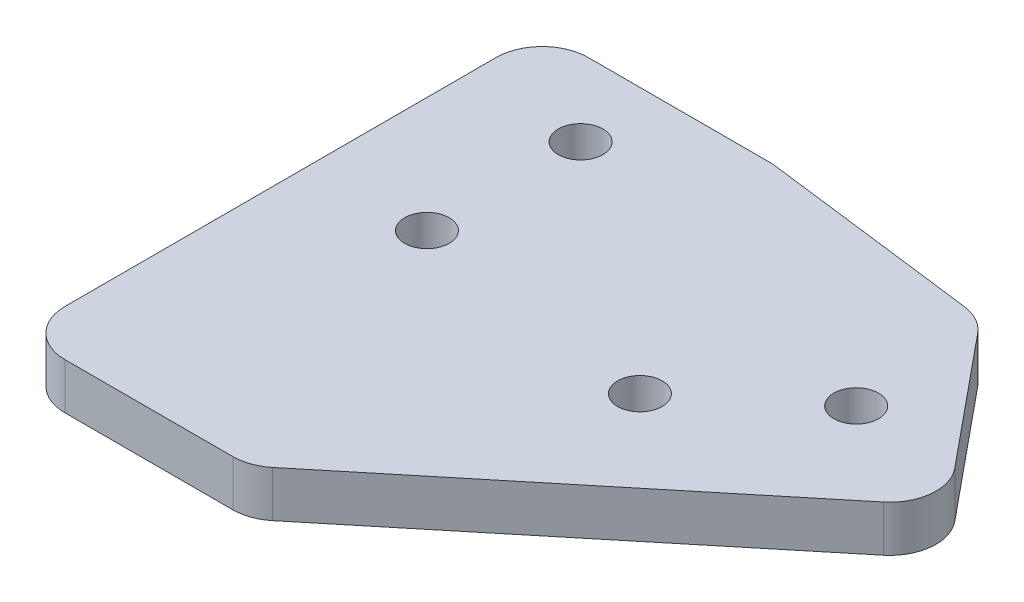
ISO-10303-21;
HEADER;
FILE_DESCRIPTION(('STEP AP214'),'2;1');
FILE_NAME('part.step','',(''),(''),'','','');
FILE_SCHEMA(('AUTOMOTIVE_DESIGN { 1 0 10303 214 1 1 1 1 }'));
ENDSEC;
DATA;
#1=APPLICATION_CONTEXT('core data for automotive mechanical design processes');
#2=APPLICATION_PROTOCOL_DEFINITION('international standard','automotive_design',2000,#1);
#3=PRODUCT_CONTEXT('',#1,'mechanical');
#4=PRODUCT('Part','Part','',(#3));
#5=PRODUCT_RELATED_PRODUCT_CATEGORY('part','',(#4));
#6=PRODUCT_DEFINITION_FORMATION('','',#4);
#7=PRODUCT_DEFINITION_CONTEXT('part definition',#1,'design');
#8=PRODUCT_DEFINITION('design','',#6,#7);
#9=PRODUCT_DEFINITION_SHAPE('','',#8);
#10=(LENGTH_UNIT() NAMED_UNIT(*) SI_UNIT(.MILLI.,.METRE.));
#11=(NAMED_UNIT(*) PLANE_ANGLE_UNIT() SI_UNIT($,.RADIAN.));
#12=(NAMED_UNIT(*) SI_UNIT($,.STERADIAN.) SOLID_ANGLE_UNIT());
#13=UNCERTAINTY_MEASURE_WITH_UNIT(LENGTH_MEASURE(1.E-05),#10,'distance_accuracy_value','');
#14=(GEOMETRIC_REPRESENTATION_CONTEXT(3) GLOBAL_UNCERTAINTY_ASSIGNED_CONTEXT((#13)) GLOBAL_UNIT_ASSIGNED_CONTEXT((#10,
#11,#12)) REPRESENTATION_CONTEXT('',''));
#15=CARTESIAN_POINT('',(0.,0.,0.));
#16=DIRECTION('',(0.,0.,1.));
#17=DIRECTION('',(1.,0.,0.));
#18=AXIS2_PLACEMENT_3D('',#15,#16,#17);
#19=CARTESIAN_POINT('',(0.,3.,0.));
#20=DIRECTION('',(0.,1.,0.));
#21=DIRECTION('',(0.,0.,1.));
#22=AXIS2_PLACEMENT_3D('',#19,#20,#21);
#23=PLANE('',#22);
#24=CARTESIAN_POINT('',(-192.5,3.,-20.));
#25=DIRECTION('',(0.,1.,0.));
#26=DIRECTION('',(0.,0.,1.));
#27=AXIS2_PLACEMENT_3D('',#24,#25,#26);
#28=CIRCLE('',#27,1.45);
#29=CARTESIAN_POINT('',(-192.5,3.,-18.55));
#30=VERTEX_POINT('',#29);
#31=EDGE_CURVE('E340',#30,#30,#28,.T.);
#32=ORIENTED_EDGE('',*,*,#31,.F.);
#33=EDGE_LOOP('',(#32));
#34=FACE_BOUND('',#33,.T.);
#35=CARTESIAN_POINT('',(-176.375827257806,3.,-7.73583593589446));
#36=DIRECTION('',(0.,1.,0.));
#37=DIRECTION('',(0.,0.,1.));
#38=AXIS2_PLACEMENT_3D('',#35,#36,#37);
#39=CIRCLE('',#38,1.45);
#40=CARTESIAN_POINT('',(-176.375827257806,3.,-6.28583593589446));
#41=VERTEX_POINT('',#40);
#42=EDGE_CURVE('E159',#41,#41,#39,.T.);
#43=ORIENTED_EDGE('',*,*,#42,.F.);
#44=EDGE_LOOP('',(#43));
#45=FACE_BOUND('',#44,.T.);
#46=DIRECTION('',(1.,0.,0.));
#47=VECTOR('',#46,1.);
#48=CARTESIAN_POINT('',(-185.,3.,9.05416514357188));
#49=LINE('',#48,#47);
#50=CARTESIAN_POINT('',(-197.,3.,9.05416514357169));
#51=VERTEX_POINT('',#50);
#52=CARTESIAN_POINT('',(-186.074172311059,3.,9.05416514357186));
#53=VERTEX_POINT('',#52);
#54=EDGE_CURVE('E168',#51,#53,#49,.T.);
#55=ORIENTED_EDGE('',*,*,#54,.T.);
#56=CARTESIAN_POINT('',(-186.074172311059,3.,6.05416514357186));
#57=DIRECTION('',(0.,1.,0.));
#58=DIRECTION('',(0.,0.,1.));
#59=AXIS2_PLACEMENT_3D('',#56,#57,#58);
#60=CIRCLE('',#59,3.);
#61=CARTESIAN_POINT('',(-184.169957759636,3.,8.37234696175367));
#62=VERTEX_POINT('',#61);
#63=EDGE_CURVE('E201',#53,#62,#60,.T.);
#64=ORIENTED_EDGE('',*,*,#63,.T.);
#65=DIRECTION('',(0.772727272727269,0.,-0.634738183807683));
#66=VECTOR('',#65,1.);
#67=CARTESIAN_POINT('',(-175.478927242885,3.,1.23330952859855));
#68=LINE('',#67,#66);
#69=CARTESIAN_POINT('',(-162.342563606521,3.,-9.55723959613203));
#70=VERTEX_POINT('',#69);
#71=EDGE_CURVE('E151',#62,#70,#68,.T.);
#72=ORIENTED_EDGE('',*,*,#71,.T.);
#73=CARTESIAN_POINT('',(-164.246778157944,3.,-11.8754214143139));
#74=DIRECTION('',(0.,1.,0.));
#75=DIRECTION('',(0.,0.,1.));
#76=AXIS2_PLACEMENT_3D('',#73,#74,#75);
#77=CIRCLE('',#76,3.);
#78=CARTESIAN_POINT('',(-161.928596339762,3.,-13.7796359657369));
#79=VERTEX_POINT('',#78);
#80=EDGE_CURVE('E192',#70,#79,#77,.T.);
#81=ORIENTED_EDGE('',*,*,#80,.T.);
#82=DIRECTION('',(-0.634738183807678,0.,-0.772727272727273));
#83=VECTOR('',#82,1.);
#84=CARTESIAN_POINT('',(-169.545454545455,3.,-23.0523632384641));
#85=LINE('',#84,#83);
#86=CARTESIAN_POINT('',(-168.787354467329,3.,-22.1294557771389));
#87=VERTEX_POINT('',#86);
#88=EDGE_CURVE('E223',#79,#87,#85,.T.);
#89=ORIENTED_EDGE('',*,*,#88,.T.);
#90=CARTESIAN_POINT('',(-171.105536285511,3.,-20.2252412257158));
#91=DIRECTION('',(0.,1.,0.));
#92=DIRECTION('',(0.,0.,1.));
#93=AXIS2_PLACEMENT_3D('',#90,#91,#92);
#94=CIRCLE('',#93,3.);
#95=CARTESIAN_POINT('',(-170.730432572867,3.,-23.2016983822629));
#96=VERTEX_POINT('',#95);
#97=EDGE_CURVE('E194',#87,#96,#94,.T.);
#98=ORIENTED_EDGE('',*,*,#97,.T.);
#99=DIRECTION('',(-0.992152385515707,0.,-0.125034570881383));
#100=VECTOR('',#99,1.);
#101=CARTESIAN_POINT('',(-185.,3.,-25.));
#102=LINE('',#101,#100);
#103=CARTESIAN_POINT('',(-184.813186959983,3.,-24.9764571565471));
#104=VERTEX_POINT('',#103);
#105=EDGE_CURVE('E236',#96,#104,#102,.T.);
#106=ORIENTED_EDGE('',*,*,#105,.T.);
#107=CARTESIAN_POINT('',(-185.188290672627,3.,-22.));
#108=DIRECTION('',(0.,1.,0.));
#109=DIRECTION('',(0.,0.,1.));
#110=AXIS2_PLACEMENT_3D('',#107,#108,#109);
#111=CIRCLE('',#110,3.);
#112=CARTESIAN_POINT('',(-185.188290672627,3.,-25.));
#113=VERTEX_POINT('',#112);
#114=EDGE_CURVE('E196',#104,#113,#111,.T.);
#115=ORIENTED_EDGE('',*,*,#114,.T.);
#116=DIRECTION('',(-1.,0.,0.));
#117=VECTOR('',#116,1.);
#118=CARTESIAN_POINT('',(-200.,3.,-25.));
#119=LINE('',#118,#117);
#120=CARTESIAN_POINT('',(-197.,3.,-25.));
#121=VERTEX_POINT('',#120);
#122=EDGE_CURVE('E238',#113,#121,#119,.T.);
#123=ORIENTED_EDGE('',*,*,#122,.T.);
#124=CARTESIAN_POINT('',(-197.,3.,-22.));
#125=DIRECTION('',(0.,1.,0.));
#126=DIRECTION('',(0.,0.,1.));
#127=AXIS2_PLACEMENT_3D('',#124,#125,#126);
#128=CIRCLE('',#127,3.);
#129=CARTESIAN_POINT('',(-200.,3.,-22.));
#130=VERTEX_POINT('',#129);
#131=EDGE_CURVE('E63',#121,#130,#128,.T.);
#132=ORIENTED_EDGE('',*,*,#131,.T.);
#133=DIRECTION('',(0.,0.,1.));
#134=VECTOR('',#133,1.);
#135=CARTESIAN_POINT('',(-200.,3.,4.91734106754618));
#136=LINE('',#135,#134);
#137=CARTESIAN_POINT('',(-200.,3.,6.05416514357169));
#138=VERTEX_POINT('',#137);
#139=EDGE_CURVE('E240',#130,#138,#136,.T.);
#140=ORIENTED_EDGE('',*,*,#139,.T.);
#141=CARTESIAN_POINT('',(-197.,3.,6.05416514357169));
#142=DIRECTION('',(0.,1.,0.));
#143=DIRECTION('',(0.,0.,1.));
#144=AXIS2_PLACEMENT_3D('',#141,#142,#143);
#145=CIRCLE('',#144,3.);
#146=EDGE_CURVE('E199',#138,#51,#145,.T.);
#147=ORIENTED_EDGE('',*,*,#146,.T.);
#148=EDGE_LOOP('',(#55,#64,#72,#81,#89,#98,#106,#115,#123,#132,#140,#147));
#149=FACE_BOUND('',#148,.T.);
#150=CARTESIAN_POINT('',(-168.648554530533,3.,-14.0832177739712));
#151=DIRECTION('',(0.,1.,0.));
#152=DIRECTION('',(0.,0.,1.));
#153=AXIS2_PLACEMENT_3D('',#150,#151,#152);
#154=CIRCLE('',#153,1.45);
#155=CARTESIAN_POINT('',(-168.648554530533,3.,-12.6332177739712));
#156=VERTEX_POINT('',#155);
#157=EDGE_CURVE('E335',#156,#156,#154,.T.);
#158=ORIENTED_EDGE('',*,*,#157,.F.);
#159=EDGE_LOOP('',(#158));
#160=FACE_BOUND('',#159,.T.);
#161=CARTESIAN_POINT('',(-192.5,3.,-9.99999999999996));
#162=DIRECTION('',(0.,1.,0.));
#163=DIRECTION('',(0.,0.,1.));
#164=AXIS2_PLACEMENT_3D('',#161,#162,#163);
#165=CIRCLE('',#164,1.45);
#166=CARTESIAN_POINT('',(-192.5,3.,-8.54999999999996));
#167=VERTEX_POINT('',#166);
#168=EDGE_CURVE('E346',#167,#167,#165,.T.);
#169=ORIENTED_EDGE('',*,*,#168,.F.);
#170=EDGE_LOOP('',(#169));
#171=FACE_BOUND('',#170,.T.);
#172=ADVANCED_FACE('F41',(#34,#45,#149,#160,#171),#23,.T.);
#173=CARTESIAN_POINT('',(0.,0.,0.));
#174=DIRECTION('',(0.,1.,0.));
#175=DIRECTION('',(0.,0.,1.));
#176=AXIS2_PLACEMENT_3D('',#173,#174,#175);
#177=PLANE('',#176);
#178=DIRECTION('',(0.772727272727269,0.,-0.634738183807684));
#179=VECTOR('',#178,1.);
#180=CARTESIAN_POINT('',(-160.024381788339,0.,-11.4614541475551));
#181=LINE('',#180,#179);
#182=CARTESIAN_POINT('',(-184.169957759636,0.,8.37234696175367));
#183=VERTEX_POINT('',#182);
#184=CARTESIAN_POINT('',(-162.342563606521,0.,-9.55723959613205));
#185=VERTEX_POINT('',#184);
#186=EDGE_CURVE('E148',#183,#185,#181,.T.);
#187=ORIENTED_EDGE('',*,*,#186,.F.);
#188=CARTESIAN_POINT('',(-186.074172311059,0.,6.05416514357186));
#189=DIRECTION('',(0.,1.,0.));
#190=DIRECTION('',(0.,0.,1.));
#191=AXIS2_PLACEMENT_3D('',#188,#189,#190);
#192=CIRCLE('',#191,3.);
#193=CARTESIAN_POINT('',(-186.074172311059,0.,9.05416514357186));
#194=VERTEX_POINT('',#193);
#195=EDGE_CURVE('E131',#183,#194,#192,.F.);
#196=ORIENTED_EDGE('',*,*,#195,.T.);
#197=DIRECTION('',(1.,0.,0.));
#198=VECTOR('',#197,1.);
#199=CARTESIAN_POINT('',(-185.,0.,9.05416514357188));
#200=LINE('',#199,#198);
#201=CARTESIAN_POINT('',(-197.,0.,9.05416514357169));
#202=VERTEX_POINT('',#201);
#203=EDGE_CURVE('E178',#202,#194,#200,.T.);
#204=ORIENTED_EDGE('',*,*,#203,.F.);
#205=CARTESIAN_POINT('',(-197.,0.,6.05416514357169));
#206=DIRECTION('',(0.,1.,0.));
#207=DIRECTION('',(0.,0.,1.));
#208=AXIS2_PLACEMENT_3D('',#205,#206,#207);
#209=CIRCLE('',#208,3.);
#210=CARTESIAN_POINT('',(-200.,0.,6.05416514357169));
#211=VERTEX_POINT('',#210);
#212=EDGE_CURVE('E142',#202,#211,#209,.F.);
#213=ORIENTED_EDGE('',*,*,#212,.T.);
#214=DIRECTION('',(0.,0.,1.));
#215=VECTOR('',#214,1.);
#216=CARTESIAN_POINT('',(-200.,0.,9.05416514357164));
#217=LINE('',#216,#215);
#218=CARTESIAN_POINT('',(-200.,0.,-22.));
#219=VERTEX_POINT('',#218);
#220=EDGE_CURVE('E176',#219,#211,#217,.T.);
#221=ORIENTED_EDGE('',*,*,#220,.F.);
#222=CARTESIAN_POINT('',(-197.,0.,-22.));
#223=DIRECTION('',(0.,1.,0.));
#224=DIRECTION('',(0.,0.,1.));
#225=AXIS2_PLACEMENT_3D('',#222,#223,#224);
#226=CIRCLE('',#225,3.);
#227=CARTESIAN_POINT('',(-197.,0.,-25.));
#228=VERTEX_POINT('',#227);
#229=EDGE_CURVE('E186',#219,#228,#226,.F.);
#230=ORIENTED_EDGE('',*,*,#229,.T.);
#231=DIRECTION('',(-1.,0.,0.));
#232=VECTOR('',#231,1.);
#233=CARTESIAN_POINT('',(-200.,0.,-25.));
#234=LINE('',#233,#232);
#235=CARTESIAN_POINT('',(-185.188290672627,0.,-25.));
#236=VERTEX_POINT('',#235);
#237=EDGE_CURVE('E173',#236,#228,#234,.T.);
#238=ORIENTED_EDGE('',*,*,#237,.F.);
#239=CARTESIAN_POINT('',(-185.188290672627,0.,-22.));
#240=DIRECTION('',(0.,1.,0.));
#241=DIRECTION('',(0.,0.,1.));
#242=AXIS2_PLACEMENT_3D('',#239,#240,#241);
#243=CIRCLE('',#242,3.);
#244=CARTESIAN_POINT('',(-184.813186959983,0.,-24.9764571565471));
#245=VERTEX_POINT('',#244);
#246=EDGE_CURVE('E184',#236,#245,#243,.F.);
#247=ORIENTED_EDGE('',*,*,#246,.T.);
#248=DIRECTION('',(-0.992152385515707,0.,-0.125034570881383));
#249=VECTOR('',#248,1.);
#250=CARTESIAN_POINT('',(-185.,0.,-25.));
#251=LINE('',#250,#249);
#252=CARTESIAN_POINT('',(-170.730432572867,0.,-23.2016983822629));
#253=VERTEX_POINT('',#252);
#254=EDGE_CURVE('E162',#253,#245,#251,.T.);
#255=ORIENTED_EDGE('',*,*,#254,.F.);
#256=CARTESIAN_POINT('',(-171.105536285511,0.,-20.2252412257158));
#257=DIRECTION('',(0.,1.,0.));
#258=DIRECTION('',(0.,0.,1.));
#259=AXIS2_PLACEMENT_3D('',#256,#257,#258);
#260=CIRCLE('',#259,3.);
#261=CARTESIAN_POINT('',(-168.787354467329,0.,-22.1294557771389));
#262=VERTEX_POINT('',#261);
#263=EDGE_CURVE('E182',#253,#262,#260,.F.);
#264=ORIENTED_EDGE('',*,*,#263,.T.);
#265=DIRECTION('',(-0.634738183807678,0.,-0.772727272727273));
#266=VECTOR('',#265,1.);
#267=CARTESIAN_POINT('',(-169.545454545455,0.,-23.0523632384641));
#268=LINE('',#267,#266);
#269=CARTESIAN_POINT('',(-161.928596339762,0.,-13.7796359657369));
#270=VERTEX_POINT('',#269);
#271=EDGE_CURVE('E158',#270,#262,#268,.T.);
#272=ORIENTED_EDGE('',*,*,#271,.F.);
#273=CARTESIAN_POINT('',(-164.246778157944,0.,-11.8754214143139));
#274=DIRECTION('',(0.,1.,0.));
#275=DIRECTION('',(0.,0.,1.));
#276=AXIS2_PLACEMENT_3D('',#273,#274,#275);
#277=CIRCLE('',#276,3.);
#278=EDGE_CURVE('E152',#270,#185,#277,.F.);
#279=ORIENTED_EDGE('',*,*,#278,.T.);
#280=EDGE_LOOP('',(#187,#196,#204,#213,#221,#230,#238,#247,#255,#264,#272,#279));
#281=FACE_BOUND('',#280,.T.);
#282=CARTESIAN_POINT('',(-176.375827257806,0.,-7.73583593589446));
#283=DIRECTION('',(0.,1.,0.));
#284=DIRECTION('',(0.,0.,1.));
#285=AXIS2_PLACEMENT_3D('',#282,#283,#284);
#286=CIRCLE('',#285,1.45);
#287=CARTESIAN_POINT('',(-176.375827257806,0.,-6.28583593589446));
#288=VERTEX_POINT('',#287);
#289=EDGE_CURVE('E165',#288,#288,#286,.T.);
#290=ORIENTED_EDGE('',*,*,#289,.T.);
#291=EDGE_LOOP('',(#290));
#292=FACE_BOUND('',#291,.T.);
#293=CARTESIAN_POINT('',(-168.648554530533,0.,-14.0832177739712));
#294=DIRECTION('',(0.,1.,0.));
#295=DIRECTION('',(0.,0.,1.));
#296=AXIS2_PLACEMENT_3D('',#293,#294,#295);
#297=CIRCLE('',#296,1.45);
#298=CARTESIAN_POINT('',(-168.648554530533,0.,-12.6332177739712));
#299=VERTEX_POINT('',#298);
#300=EDGE_CURVE('E337',#299,#299,#297,.T.);
#301=ORIENTED_EDGE('',*,*,#300,.T.);
#302=EDGE_LOOP('',(#301));
#303=FACE_BOUND('',#302,.T.);
#304=CARTESIAN_POINT('',(-192.5,0.,-20.));
#305=DIRECTION('',(0.,1.,0.));
#306=DIRECTION('',(0.,0.,1.));
#307=AXIS2_PLACEMENT_3D('',#304,#305,#306);
#308=CIRCLE('',#307,1.45);
#309=CARTESIAN_POINT('',(-192.5,0.,-18.55));
#310=VERTEX_POINT('',#309);
#311=EDGE_CURVE('E343',#310,#310,#308,.T.);
#312=ORIENTED_EDGE('',*,*,#311,.T.);
#313=EDGE_LOOP('',(#312));
#314=FACE_BOUND('',#313,.T.);
#315=CARTESIAN_POINT('',(-192.5,0.,-9.99999999999996));
#316=DIRECTION('',(0.,1.,0.));
#317=DIRECTION('',(0.,0.,1.));
#318=AXIS2_PLACEMENT_3D('',#315,#316,#317);
#319=CIRCLE('',#318,1.45);
#320=CARTESIAN_POINT('',(-192.5,0.,-8.54999999999996));
#321=VERTEX_POINT('',#320);
#322=EDGE_CURVE('E349',#321,#321,#319,.T.);
#323=ORIENTED_EDGE('',*,*,#322,.T.);
#324=EDGE_LOOP('',(#323));
#325=FACE_BOUND('',#324,.T.);
#326=ADVANCED_FACE('F155',(#281,#292,#303,#314,#325),#177,.F.);
#327=CARTESIAN_POINT('',(-160.024381788339,3.,-11.4614541475551));
#328=DIRECTION('',(-0.634738183807684,0.,-0.772727272727269));
#329=DIRECTION('',(-0.772727272727269,0.,0.634738183807684));
#330=AXIS2_PLACEMENT_3D('',#327,#328,#329);
#331=PLANE('',#330);
#332=ORIENTED_EDGE('',*,*,#71,.F.);
#333=DIRECTION('',(0.,-1.,0.));
#334=VECTOR('',#333,1.);
#335=CARTESIAN_POINT('',(-184.169957759636,3.,8.37234696175368));
#336=LINE('',#335,#334);
#337=EDGE_CURVE('E135',#62,#183,#336,.T.);
#338=ORIENTED_EDGE('',*,*,#337,.T.);
#339=ORIENTED_EDGE('',*,*,#186,.T.);
#340=DIRECTION('',(0.,-1.,0.));
#341=VECTOR('',#340,1.);
#342=CARTESIAN_POINT('',(-162.342563606521,3.,-9.55723959613205));
#343=LINE('',#342,#341);
#344=EDGE_CURVE('E153',#185,#70,#343,.F.);
#345=ORIENTED_EDGE('',*,*,#344,.T.);
#346=EDGE_LOOP('',(#332,#338,#339,#345));
#347=FACE_BOUND('',#346,.T.);
#348=ADVANCED_FACE('F147',(#347),#331,.F.);
#349=CARTESIAN_POINT('',(-169.545454545455,3.,-23.0523632384641));
#350=DIRECTION('',(-0.772727272727273,0.,0.634738183807679));
#351=DIRECTION('',(0.634738183807679,0.,0.772727272727273));
#352=AXIS2_PLACEMENT_3D('',#349,#350,#351);
#353=PLANE('',#352);
#354=ORIENTED_EDGE('',*,*,#271,.T.);
#355=DIRECTION('',(0.,-1.,0.));
#356=VECTOR('',#355,1.);
#357=CARTESIAN_POINT('',(-168.787354467329,3.,-22.1294557771389));
#358=LINE('',#357,#356);
#359=EDGE_CURVE('E11',#262,#87,#358,.F.);
#360=ORIENTED_EDGE('',*,*,#359,.T.);
#361=ORIENTED_EDGE('',*,*,#88,.F.);
#362=DIRECTION('',(0.,-1.,0.));
#363=VECTOR('',#362,1.);
#364=CARTESIAN_POINT('',(-161.928596339762,3.,-13.7796359657369));
#365=LINE('',#364,#363);
#366=EDGE_CURVE('E49',#79,#270,#365,.T.);
#367=ORIENTED_EDGE('',*,*,#366,.T.);
#368=EDGE_LOOP('',(#354,#360,#361,#367));
#369=FACE_BOUND('',#368,.T.);
#370=ADVANCED_FACE('F220',(#369),#353,.F.);
#371=CARTESIAN_POINT('',(-185.,3.,-25.));
#372=DIRECTION('',(-0.125034570881383,0.,0.992152385515707));
#373=DIRECTION('',(0.992152385515707,0.,0.125034570881383));
#374=AXIS2_PLACEMENT_3D('',#371,#372,#373);
#375=PLANE('',#374);
#376=ORIENTED_EDGE('',*,*,#254,.T.);
#377=DIRECTION('',(0.,-1.,0.));
#378=VECTOR('',#377,1.);
#379=CARTESIAN_POINT('',(-184.813186959983,3.,-24.9764571565471));
#380=LINE('',#379,#378);
#381=EDGE_CURVE('E215',#245,#104,#380,.F.);
#382=ORIENTED_EDGE('',*,*,#381,.T.);
#383=ORIENTED_EDGE('',*,*,#105,.F.);
#384=DIRECTION('',(0.,-1.,0.));
#385=VECTOR('',#384,1.);
#386=CARTESIAN_POINT('',(-170.730432572867,3.,-23.2016983822629));
#387=LINE('',#386,#385);
#388=EDGE_CURVE('E212',#96,#253,#387,.T.);
#389=ORIENTED_EDGE('',*,*,#388,.T.);
#390=EDGE_LOOP('',(#376,#382,#383,#389));
#391=FACE_BOUND('',#390,.T.);
#392=ADVANCED_FACE('F233',(#391),#375,.F.);
#393=CARTESIAN_POINT('',(-200.,3.,-25.));
#394=DIRECTION('',(0.,0.,1.));
#395=DIRECTION('',(1.,0.,0.));
#396=AXIS2_PLACEMENT_3D('',#393,#394,#395);
#397=PLANE('',#396);
#398=ORIENTED_EDGE('',*,*,#237,.T.);
#399=DIRECTION('',(0.,-1.,0.));
#400=VECTOR('',#399,1.);
#401=CARTESIAN_POINT('',(-197.,3.,-25.));
#402=LINE('',#401,#400);
#403=EDGE_CURVE('E210',#228,#121,#402,.F.);
#404=ORIENTED_EDGE('',*,*,#403,.T.);
#405=ORIENTED_EDGE('',*,*,#122,.F.);
#406=DIRECTION('',(0.,-1.,0.));
#407=VECTOR('',#406,1.);
#408=CARTESIAN_POINT('',(-185.188290672627,3.,-25.));
#409=LINE('',#408,#407);
#410=EDGE_CURVE('E207',#113,#236,#409,.T.);
#411=ORIENTED_EDGE('',*,*,#410,.T.);
#412=EDGE_LOOP('',(#398,#404,#405,#411));
#413=FACE_BOUND('',#412,.T.);
#414=ADVANCED_FACE('F261',(#413),#397,.F.);
#415=CARTESIAN_POINT('',(-200.,3.,9.05416514357164));
#416=DIRECTION('',(1.,0.,0.));
#417=DIRECTION('',(0.,0.,-1.));
#418=AXIS2_PLACEMENT_3D('',#415,#416,#417);
#419=PLANE('',#418);
#420=ORIENTED_EDGE('',*,*,#220,.T.);
#421=DIRECTION('',(0.,-1.,0.));
#422=VECTOR('',#421,1.);
#423=CARTESIAN_POINT('',(-200.,3.,6.05416514357169));
#424=LINE('',#423,#422);
#425=EDGE_CURVE('E56',#211,#138,#424,.F.);
#426=ORIENTED_EDGE('',*,*,#425,.T.);
#427=ORIENTED_EDGE('',*,*,#139,.F.);
#428=DIRECTION('',(0.,-1.,0.));
#429=VECTOR('',#428,1.);
#430=CARTESIAN_POINT('',(-200.,3.,-22.));
#431=LINE('',#430,#429);
#432=EDGE_CURVE('E203',#130,#219,#431,.T.);
#433=ORIENTED_EDGE('',*,*,#432,.T.);
#434=EDGE_LOOP('',(#420,#426,#427,#433));
#435=FACE_BOUND('',#434,.T.);
#436=ADVANCED_FACE('F254',(#435),#419,.F.);
#437=CARTESIAN_POINT('',(-185.,3.,9.05416514357188));
#438=DIRECTION('',(0.,0.,-1.));
#439=DIRECTION('',(-1.,0.,0.));
#440=AXIS2_PLACEMENT_3D('',#437,#438,#439);
#441=PLANE('',#440);
#442=ORIENTED_EDGE('',*,*,#203,.T.);
#443=DIRECTION('',(0.,-1.,0.));
#444=VECTOR('',#443,1.);
#445=CARTESIAN_POINT('',(-186.074172311059,3.,9.05416514357186));
#446=LINE('',#445,#444);
#447=EDGE_CURVE('E136',#194,#53,#446,.F.);
#448=ORIENTED_EDGE('',*,*,#447,.T.);
#449=ORIENTED_EDGE('',*,*,#54,.F.);
#450=DIRECTION('',(0.,-1.,0.));
#451=VECTOR('',#450,1.);
#452=CARTESIAN_POINT('',(-197.,3.,9.05416514357169));
#453=LINE('',#452,#451);
#454=EDGE_CURVE('E141',#51,#202,#453,.T.);
#455=ORIENTED_EDGE('',*,*,#454,.T.);
#456=EDGE_LOOP('',(#442,#448,#449,#455));
#457=FACE_BOUND('',#456,.T.);
#458=ADVANCED_FACE('F250',(#457),#441,.F.);
#459=CARTESIAN_POINT('',(-176.375827257806,3.,-7.73583593589446));
#460=DIRECTION('',(0.,-1.,0.));
#461=DIRECTION('',(0.,0.,-1.));
#462=AXIS2_PLACEMENT_3D('',#459,#460,#461);
#463=CYLINDRICAL_SURFACE('',#462,1.45);
#464=ORIENTED_EDGE('',*,*,#42,.T.);
#465=EDGE_LOOP('',(#464));
#466=FACE_BOUND('',#465,.T.);
#467=ORIENTED_EDGE('',*,*,#289,.F.);
#468=EDGE_LOOP('',(#467));
#469=FACE_BOUND('',#468,.T.);
#470=ADVANCED_FACE('F284',(#466,#469),#463,.F.);
#471=CARTESIAN_POINT('',(-168.648554530533,3.,-14.0832177739712));
#472=DIRECTION('',(0.,-1.,0.));
#473=DIRECTION('',(0.,0.,-1.));
#474=AXIS2_PLACEMENT_3D('',#471,#472,#473);
#475=CYLINDRICAL_SURFACE('',#474,1.45);
#476=ORIENTED_EDGE('',*,*,#157,.T.);
#477=EDGE_LOOP('',(#476));
#478=FACE_BOUND('',#477,.T.);
#479=ORIENTED_EDGE('',*,*,#300,.F.);
#480=EDGE_LOOP('',(#479));
#481=FACE_BOUND('',#480,.T.);
#482=ADVANCED_FACE('F364',(#478,#481),#475,.F.);
#483=CARTESIAN_POINT('',(-192.5,3.,-20.));
#484=DIRECTION('',(0.,-1.,0.));
#485=DIRECTION('',(0.,0.,-1.));
#486=AXIS2_PLACEMENT_3D('',#483,#484,#485);
#487=CYLINDRICAL_SURFACE('',#486,1.45);
#488=ORIENTED_EDGE('',*,*,#31,.T.);
#489=EDGE_LOOP('',(#488));
#490=FACE_BOUND('',#489,.T.);
#491=ORIENTED_EDGE('',*,*,#311,.F.);
#492=EDGE_LOOP('',(#491));
#493=FACE_BOUND('',#492,.T.);
#494=ADVANCED_FACE('F357',(#490,#493),#487,.F.);
#495=CARTESIAN_POINT('',(-192.5,3.,-9.99999999999996));
#496=DIRECTION('',(0.,-1.,0.));
#497=DIRECTION('',(0.,0.,-1.));
#498=AXIS2_PLACEMENT_3D('',#495,#496,#497);
#499=CYLINDRICAL_SURFACE('',#498,1.45);
#500=ORIENTED_EDGE('',*,*,#168,.T.);
#501=EDGE_LOOP('',(#500));
#502=FACE_BOUND('',#501,.T.);
#503=ORIENTED_EDGE('',*,*,#322,.F.);
#504=EDGE_LOOP('',(#503));
#505=FACE_BOUND('',#504,.T.);
#506=ADVANCED_FACE('F301',(#502,#505),#499,.F.);
#507=CARTESIAN_POINT('',(-186.074172311059,3.,6.05416514357186));
#508=DIRECTION('',(0.,-1.,0.));
#509=DIRECTION('',(0.,0.,-1.));
#510=AXIS2_PLACEMENT_3D('',#507,#508,#509);
#511=CYLINDRICAL_SURFACE('',#510,3.);
#512=ORIENTED_EDGE('',*,*,#63,.F.);
#513=ORIENTED_EDGE('',*,*,#447,.F.);
#514=ORIENTED_EDGE('',*,*,#195,.F.);
#515=ORIENTED_EDGE('',*,*,#337,.F.);
#516=EDGE_LOOP('',(#512,#513,#514,#515));
#517=FACE_BOUND('',#516,.T.);
#518=ADVANCED_FACE('F134',(#517),#511,.T.);
#519=CARTESIAN_POINT('',(-197.,3.,6.05416514357169));
#520=DIRECTION('',(0.,-1.,0.));
#521=DIRECTION('',(0.,0.,-1.));
#522=AXIS2_PLACEMENT_3D('',#519,#520,#521);
#523=CYLINDRICAL_SURFACE('',#522,3.);
#524=ORIENTED_EDGE('',*,*,#146,.F.);
#525=ORIENTED_EDGE('',*,*,#425,.F.);
#526=ORIENTED_EDGE('',*,*,#212,.F.);
#527=ORIENTED_EDGE('',*,*,#454,.F.);
#528=EDGE_LOOP('',(#524,#525,#526,#527));
#529=FACE_BOUND('',#528,.T.);
#530=ADVANCED_FACE('F252',(#529),#523,.T.);
#531=CARTESIAN_POINT('',(-197.,3.,-22.));
#532=DIRECTION('',(0.,-1.,0.));
#533=DIRECTION('',(0.,0.,-1.));
#534=AXIS2_PLACEMENT_3D('',#531,#532,#533);
#535=CYLINDRICAL_SURFACE('',#534,3.);
#536=ORIENTED_EDGE('',*,*,#131,.F.);
#537=ORIENTED_EDGE('',*,*,#403,.F.);
#538=ORIENTED_EDGE('',*,*,#229,.F.);
#539=ORIENTED_EDGE('',*,*,#432,.F.);
#540=EDGE_LOOP('',(#536,#537,#538,#539));
#541=FACE_BOUND('',#540,.T.);
#542=ADVANCED_FACE('F257',(#541),#535,.T.);
#543=CARTESIAN_POINT('',(-185.188290672627,3.,-22.));
#544=DIRECTION('',(0.,-1.,0.));
#545=DIRECTION('',(0.,0.,-1.));
#546=AXIS2_PLACEMENT_3D('',#543,#544,#545);
#547=CYLINDRICAL_SURFACE('',#546,3.);
#548=ORIENTED_EDGE('',*,*,#114,.F.);
#549=ORIENTED_EDGE('',*,*,#381,.F.);
#550=ORIENTED_EDGE('',*,*,#246,.F.);
#551=ORIENTED_EDGE('',*,*,#410,.F.);
#552=EDGE_LOOP('',(#548,#549,#550,#551));
#553=FACE_BOUND('',#552,.T.);
#554=ADVANCED_FACE('F265',(#553),#547,.T.);
#555=CARTESIAN_POINT('',(-171.105536285511,3.,-20.2252412257158));
#556=DIRECTION('',(0.,-1.,0.));
#557=DIRECTION('',(0.,0.,-1.));
#558=AXIS2_PLACEMENT_3D('',#555,#556,#557);
#559=CYLINDRICAL_SURFACE('',#558,3.);
#560=ORIENTED_EDGE('',*,*,#97,.F.);
#561=ORIENTED_EDGE('',*,*,#359,.F.);
#562=ORIENTED_EDGE('',*,*,#263,.F.);
#563=ORIENTED_EDGE('',*,*,#388,.F.);
#564=EDGE_LOOP('',(#560,#561,#562,#563));
#565=FACE_BOUND('',#564,.T.);
#566=ADVANCED_FACE('F230',(#565),#559,.T.);
#567=CARTESIAN_POINT('',(-164.246778157944,3.,-11.8754214143139));
#568=DIRECTION('',(0.,-1.,0.));
#569=DIRECTION('',(0.,0.,-1.));
#570=AXIS2_PLACEMENT_3D('',#567,#568,#569);
#571=CYLINDRICAL_SURFACE('',#570,3.);
#572=ORIENTED_EDGE('',*,*,#80,.F.);
#573=ORIENTED_EDGE('',*,*,#344,.F.);
#574=ORIENTED_EDGE('',*,*,#278,.F.);
#575=ORIENTED_EDGE('',*,*,#366,.F.);
#576=EDGE_LOOP('',(#572,#573,#574,#575));
#577=FACE_BOUND('',#576,.T.);
#578=ADVANCED_FACE('F43',(#577),#571,.T.);
#579=CLOSED_SHELL('',(#172,#326,#348,#370,#392,#414,#436,#458,#470,#482,#494,#506,#518,#530,
#542,#554,#566,#578));
#580=MANIFOLD_SOLID_BREP('B2',#579);
#581=ADVANCED_BREP_SHAPE_REPRESENTATION('',(#18,#580),#14);
#582=SHAPE_DEFINITION_REPRESENTATION(#9,#581);
ENDSEC;
END-ISO-10303-21;
